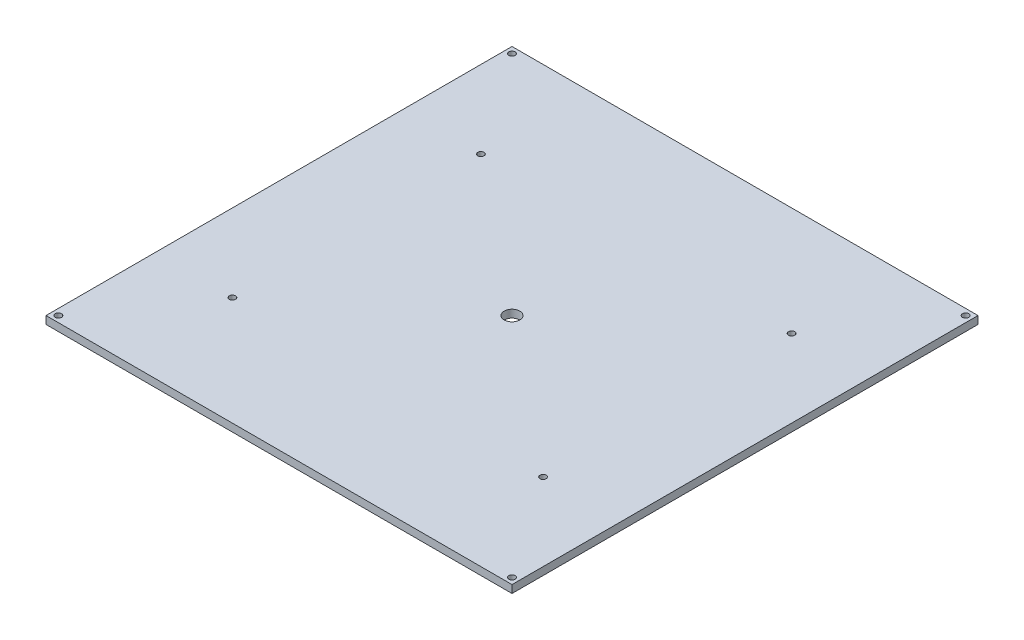
ISO-10303-21;
HEADER;
FILE_DESCRIPTION(('STEP AP214'),'2;1');
FILE_NAME('part.step','',(''),(''),'','','');
FILE_SCHEMA(('AUTOMOTIVE_DESIGN { 1 0 10303 214 1 1 1 1 }'));
ENDSEC;
DATA;
#1=APPLICATION_CONTEXT('core data for automotive mechanical design processes');
#2=APPLICATION_PROTOCOL_DEFINITION('international standard','automotive_design',2000,#1);
#3=PRODUCT_CONTEXT('',#1,'mechanical');
#4=PRODUCT('Part','Part','',(#3));
#5=PRODUCT_RELATED_PRODUCT_CATEGORY('part','',(#4));
#6=PRODUCT_DEFINITION_FORMATION('','',#4);
#7=PRODUCT_DEFINITION_CONTEXT('part definition',#1,'design');
#8=PRODUCT_DEFINITION('design','',#6,#7);
#9=PRODUCT_DEFINITION_SHAPE('','',#8);
#10=(LENGTH_UNIT() NAMED_UNIT(*) SI_UNIT(.MILLI.,.METRE.));
#11=(NAMED_UNIT(*) PLANE_ANGLE_UNIT() SI_UNIT($,.RADIAN.));
#12=(NAMED_UNIT(*) SI_UNIT($,.STERADIAN.) SOLID_ANGLE_UNIT());
#13=UNCERTAINTY_MEASURE_WITH_UNIT(LENGTH_MEASURE(1.E-05),#10,'distance_accuracy_value','');
#14=(GEOMETRIC_REPRESENTATION_CONTEXT(3) GLOBAL_UNCERTAINTY_ASSIGNED_CONTEXT((#13)) GLOBAL_UNIT_ASSIGNED_CONTEXT((#10,
#11,#12)) REPRESENTATION_CONTEXT('',''));
#15=CARTESIAN_POINT('',(0.,0.,0.));
#16=DIRECTION('',(0.,0.,1.));
#17=DIRECTION('',(1.,0.,0.));
#18=AXIS2_PLACEMENT_3D('',#15,#16,#17);
#19=CARTESIAN_POINT('',(-150.,5.,150.));
#20=DIRECTION('',(1.,0.,0.));
#21=DIRECTION('',(0.,0.,-1.));
#22=AXIS2_PLACEMENT_3D('',#19,#20,#21);
#23=PLANE('',#22);
#24=DIRECTION('',(0.,0.,1.));
#25=VECTOR('',#24,1.);
#26=CARTESIAN_POINT('',(-150.,0.,150.));
#27=LINE('',#26,#25);
#28=CARTESIAN_POINT('',(-150.,0.,-150.));
#29=VERTEX_POINT('',#28);
#30=CARTESIAN_POINT('',(-150.,0.,150.));
#31=VERTEX_POINT('',#30);
#32=EDGE_CURVE('E111',#29,#31,#27,.T.);
#33=ORIENTED_EDGE('',*,*,#32,.T.);
#34=DIRECTION('',(0.,-1.,0.));
#35=VECTOR('',#34,1.);
#36=CARTESIAN_POINT('',(-150.,5.,150.));
#37=LINE('',#36,#35);
#38=CARTESIAN_POINT('',(-150.,5.,150.));
#39=VERTEX_POINT('',#38);
#40=EDGE_CURVE('E11',#39,#31,#37,.T.);
#41=ORIENTED_EDGE('',*,*,#40,.F.);
#42=DIRECTION('',(0.,0.,1.));
#43=VECTOR('',#42,1.);
#44=CARTESIAN_POINT('',(-150.,5.,150.));
#45=LINE('',#44,#43);
#46=CARTESIAN_POINT('',(-150.,5.,-150.));
#47=VERTEX_POINT('',#46);
#48=EDGE_CURVE('E95',#47,#39,#45,.T.);
#49=ORIENTED_EDGE('',*,*,#48,.F.);
#50=DIRECTION('',(0.,-1.,0.));
#51=VECTOR('',#50,1.);
#52=CARTESIAN_POINT('',(-150.,5.,-150.));
#53=LINE('',#52,#51);
#54=EDGE_CURVE('E107',#47,#29,#53,.T.);
#55=ORIENTED_EDGE('',*,*,#54,.T.);
#56=EDGE_LOOP('',(#33,#41,#49,#55));
#57=FACE_BOUND('',#56,.T.);
#58=ADVANCED_FACE('F43',(#57),#23,.F.);
#59=CARTESIAN_POINT('',(150.,5.,150.));
#60=DIRECTION('',(0.,0.,-1.));
#61=DIRECTION('',(-1.,0.,0.));
#62=AXIS2_PLACEMENT_3D('',#59,#60,#61);
#63=PLANE('',#62);
#64=DIRECTION('',(1.,0.,0.));
#65=VECTOR('',#64,1.);
#66=CARTESIAN_POINT('',(150.,0.,150.));
#67=LINE('',#66,#65);
#68=CARTESIAN_POINT('',(150.,0.,150.));
#69=VERTEX_POINT('',#68);
#70=EDGE_CURVE('E100',#31,#69,#67,.T.);
#71=ORIENTED_EDGE('',*,*,#70,.T.);
#72=DIRECTION('',(0.,-1.,0.));
#73=VECTOR('',#72,1.);
#74=CARTESIAN_POINT('',(150.,5.,150.));
#75=LINE('',#74,#73);
#76=CARTESIAN_POINT('',(150.,5.,150.));
#77=VERTEX_POINT('',#76);
#78=EDGE_CURVE('E52',#77,#69,#75,.T.);
#79=ORIENTED_EDGE('',*,*,#78,.F.);
#80=DIRECTION('',(1.,0.,0.));
#81=VECTOR('',#80,1.);
#82=CARTESIAN_POINT('',(150.,5.,150.));
#83=LINE('',#82,#81);
#84=EDGE_CURVE('E90',#39,#77,#83,.T.);
#85=ORIENTED_EDGE('',*,*,#84,.F.);
#86=ORIENTED_EDGE('',*,*,#40,.T.);
#87=EDGE_LOOP('',(#71,#79,#85,#86));
#88=FACE_BOUND('',#87,.T.);
#89=ADVANCED_FACE('F99',(#88),#63,.F.);
#90=CARTESIAN_POINT('',(150.,5.,150.));
#91=DIRECTION('',(-1.,0.,0.));
#92=DIRECTION('',(0.,0.,1.));
#93=AXIS2_PLACEMENT_3D('',#90,#91,#92);
#94=PLANE('',#93);
#95=DIRECTION('',(0.,0.,-1.));
#96=VECTOR('',#95,1.);
#97=CARTESIAN_POINT('',(150.,0.,150.));
#98=LINE('',#97,#96);
#99=CARTESIAN_POINT('',(150.,0.,-150.));
#100=VERTEX_POINT('',#99);
#101=EDGE_CURVE('E77',#69,#100,#98,.T.);
#102=ORIENTED_EDGE('',*,*,#101,.T.);
#103=DIRECTION('',(0.,-1.,0.));
#104=VECTOR('',#103,1.);
#105=CARTESIAN_POINT('',(150.,5.,-150.));
#106=LINE('',#105,#104);
#107=CARTESIAN_POINT('',(150.,5.,-150.));
#108=VERTEX_POINT('',#107);
#109=EDGE_CURVE('E102',#108,#100,#106,.T.);
#110=ORIENTED_EDGE('',*,*,#109,.F.);
#111=DIRECTION('',(0.,0.,-1.));
#112=VECTOR('',#111,1.);
#113=CARTESIAN_POINT('',(150.,5.,150.));
#114=LINE('',#113,#112);
#115=EDGE_CURVE('E93',#77,#108,#114,.T.);
#116=ORIENTED_EDGE('',*,*,#115,.F.);
#117=ORIENTED_EDGE('',*,*,#78,.T.);
#118=EDGE_LOOP('',(#102,#110,#116,#117));
#119=FACE_BOUND('',#118,.T.);
#120=ADVANCED_FACE('F103',(#119),#94,.F.);
#121=CARTESIAN_POINT('',(150.,5.,-150.));
#122=DIRECTION('',(0.,0.,1.));
#123=DIRECTION('',(1.,0.,0.));
#124=AXIS2_PLACEMENT_3D('',#121,#122,#123);
#125=PLANE('',#124);
#126=DIRECTION('',(-1.,0.,0.));
#127=VECTOR('',#126,1.);
#128=CARTESIAN_POINT('',(150.,0.,-150.));
#129=LINE('',#128,#127);
#130=EDGE_CURVE('E83',#100,#29,#129,.T.);
#131=ORIENTED_EDGE('',*,*,#130,.T.);
#132=ORIENTED_EDGE('',*,*,#54,.F.);
#133=DIRECTION('',(-1.,0.,0.));
#134=VECTOR('',#133,1.);
#135=CARTESIAN_POINT('',(150.,5.,-150.));
#136=LINE('',#135,#134);
#137=EDGE_CURVE('E60',#108,#47,#136,.T.);
#138=ORIENTED_EDGE('',*,*,#137,.F.);
#139=ORIENTED_EDGE('',*,*,#109,.T.);
#140=EDGE_LOOP('',(#131,#132,#138,#139));
#141=FACE_BOUND('',#140,.T.);
#142=ADVANCED_FACE('F125',(#141),#125,.F.);
#143=CARTESIAN_POINT('',(0.,5.,0.));
#144=DIRECTION('',(0.,1.,0.));
#145=DIRECTION('',(0.,0.,1.));
#146=AXIS2_PLACEMENT_3D('',#143,#144,#145);
#147=PLANE('',#146);
#148=CARTESIAN_POINT('',(0.,5.,0.));
#149=DIRECTION('',(0.,1.,0.));
#150=DIRECTION('',(0.,0.,1.));
#151=AXIS2_PLACEMENT_3D('',#148,#149,#150);
#152=CIRCLE('',#151,5.);
#153=CARTESIAN_POINT('',(0.,5.,5.));
#154=VERTEX_POINT('',#153);
#155=EDGE_CURVE('E172',#154,#154,#152,.T.);
#156=ORIENTED_EDGE('',*,*,#155,.F.);
#157=EDGE_LOOP('',(#156));
#158=FACE_BOUND('',#157,.T.);
#159=CARTESIAN_POINT('',(-100.,5.,80.));
#160=DIRECTION('',(0.,1.,0.));
#161=DIRECTION('',(0.,0.,1.));
#162=AXIS2_PLACEMENT_3D('',#159,#160,#161);
#163=CIRCLE('',#162,2.);
#164=CARTESIAN_POINT('',(-100.,5.,82.));
#165=VERTEX_POINT('',#164);
#166=EDGE_CURVE('E181',#165,#165,#163,.T.);
#167=ORIENTED_EDGE('',*,*,#166,.F.);
#168=EDGE_LOOP('',(#167));
#169=FACE_BOUND('',#168,.T.);
#170=CARTESIAN_POINT('',(100.,5.,80.));
#171=DIRECTION('',(0.,1.,0.));
#172=DIRECTION('',(0.,0.,1.));
#173=AXIS2_PLACEMENT_3D('',#170,#171,#172);
#174=CIRCLE('',#173,2.);
#175=CARTESIAN_POINT('',(100.,5.,82.));
#176=VERTEX_POINT('',#175);
#177=EDGE_CURVE('E189',#176,#176,#174,.T.);
#178=ORIENTED_EDGE('',*,*,#177,.F.);
#179=EDGE_LOOP('',(#178));
#180=FACE_BOUND('',#179,.T.);
#181=CARTESIAN_POINT('',(100.,5.,-80.));
#182=DIRECTION('',(0.,1.,0.));
#183=DIRECTION('',(0.,0.,1.));
#184=AXIS2_PLACEMENT_3D('',#181,#182,#183);
#185=CIRCLE('',#184,2.);
#186=CARTESIAN_POINT('',(100.,5.,-78.));
#187=VERTEX_POINT('',#186);
#188=EDGE_CURVE('E171',#187,#187,#185,.T.);
#189=ORIENTED_EDGE('',*,*,#188,.F.);
#190=EDGE_LOOP('',(#189));
#191=FACE_BOUND('',#190,.T.);
#192=CARTESIAN_POINT('',(-100.,5.,-80.));
#193=DIRECTION('',(0.,1.,0.));
#194=DIRECTION('',(0.,0.,1.));
#195=AXIS2_PLACEMENT_3D('',#192,#193,#194);
#196=CIRCLE('',#195,2.);
#197=CARTESIAN_POINT('',(-100.,5.,-78.));
#198=VERTEX_POINT('',#197);
#199=EDGE_CURVE('E167',#198,#198,#196,.T.);
#200=ORIENTED_EDGE('',*,*,#199,.F.);
#201=EDGE_LOOP('',(#200));
#202=FACE_BOUND('',#201,.T.);
#203=CARTESIAN_POINT('',(146.,5.,146.));
#204=DIRECTION('',(0.,1.,0.));
#205=DIRECTION('',(0.,0.,-1.));
#206=AXIS2_PLACEMENT_3D('',#203,#204,#205);
#207=CIRCLE('',#206,2.04999999999999);
#208=CARTESIAN_POINT('',(146.,5.,143.95));
#209=VERTEX_POINT('',#208);
#210=EDGE_CURVE('E159',#209,#209,#207,.T.);
#211=ORIENTED_EDGE('',*,*,#210,.F.);
#212=EDGE_LOOP('',(#211));
#213=FACE_BOUND('',#212,.T.);
#214=CARTESIAN_POINT('',(146.,5.,-146.));
#215=DIRECTION('',(0.,-1.,0.));
#216=DIRECTION('',(0.,0.,1.));
#217=AXIS2_PLACEMENT_3D('',#214,#215,#216);
#218=CIRCLE('',#217,2.04999999999999);
#219=CARTESIAN_POINT('',(146.,5.,-143.95));
#220=VERTEX_POINT('',#219);
#221=EDGE_CURVE('E144',#220,#220,#218,.T.);
#222=ORIENTED_EDGE('',*,*,#221,.T.);
#223=EDGE_LOOP('',(#222));
#224=FACE_BOUND('',#223,.T.);
#225=CARTESIAN_POINT('',(-146.,5.,146.));
#226=DIRECTION('',(0.,-1.,0.));
#227=DIRECTION('',(0.,0.,-1.));
#228=AXIS2_PLACEMENT_3D('',#225,#226,#227);
#229=CIRCLE('',#228,2.04999999999999);
#230=CARTESIAN_POINT('',(-146.,5.,143.95));
#231=VERTEX_POINT('',#230);
#232=EDGE_CURVE('E139',#231,#231,#229,.T.);
#233=ORIENTED_EDGE('',*,*,#232,.T.);
#234=EDGE_LOOP('',(#233));
#235=FACE_BOUND('',#234,.T.);
#236=CARTESIAN_POINT('',(-146.,5.,-146.));
#237=DIRECTION('',(0.,1.,0.));
#238=DIRECTION('',(0.,0.,1.));
#239=AXIS2_PLACEMENT_3D('',#236,#237,#238);
#240=CIRCLE('',#239,2.04999999999999);
#241=CARTESIAN_POINT('',(-146.,5.,-143.95));
#242=VERTEX_POINT('',#241);
#243=EDGE_CURVE('E135',#242,#242,#240,.T.);
#244=ORIENTED_EDGE('',*,*,#243,.F.);
#245=EDGE_LOOP('',(#244));
#246=FACE_BOUND('',#245,.T.);
#247=ORIENTED_EDGE('',*,*,#48,.T.);
#248=ORIENTED_EDGE('',*,*,#84,.T.);
#249=ORIENTED_EDGE('',*,*,#115,.T.);
#250=ORIENTED_EDGE('',*,*,#137,.T.);
#251=EDGE_LOOP('',(#247,#248,#249,#250));
#252=FACE_BOUND('',#251,.T.);
#253=ADVANCED_FACE('F91',(#158,#169,#180,#191,#202,#213,#224,#235,#246,#252),#147,.T.);
#254=CARTESIAN_POINT('',(0.,0.,0.));
#255=DIRECTION('',(0.,1.,0.));
#256=DIRECTION('',(0.,0.,1.));
#257=AXIS2_PLACEMENT_3D('',#254,#255,#256);
#258=PLANE('',#257);
#259=CARTESIAN_POINT('',(0.,0.,0.));
#260=DIRECTION('',(0.,1.,0.));
#261=DIRECTION('',(0.,0.,1.));
#262=AXIS2_PLACEMENT_3D('',#259,#260,#261);
#263=CIRCLE('',#262,5.);
#264=CARTESIAN_POINT('',(0.,0.,5.));
#265=VERTEX_POINT('',#264);
#266=EDGE_CURVE('E177',#265,#265,#263,.F.);
#267=ORIENTED_EDGE('',*,*,#266,.F.);
#268=EDGE_LOOP('',(#267));
#269=FACE_BOUND('',#268,.T.);
#270=CARTESIAN_POINT('',(-100.,0.,80.));
#271=DIRECTION('',(0.,1.,0.));
#272=DIRECTION('',(0.,0.,1.));
#273=AXIS2_PLACEMENT_3D('',#270,#271,#272);
#274=CIRCLE('',#273,2.);
#275=CARTESIAN_POINT('',(-100.,0.,82.));
#276=VERTEX_POINT('',#275);
#277=EDGE_CURVE('E176',#276,#276,#274,.F.);
#278=ORIENTED_EDGE('',*,*,#277,.F.);
#279=EDGE_LOOP('',(#278));
#280=FACE_BOUND('',#279,.T.);
#281=CARTESIAN_POINT('',(100.,0.,80.));
#282=DIRECTION('',(0.,1.,0.));
#283=DIRECTION('',(0.,0.,1.));
#284=AXIS2_PLACEMENT_3D('',#281,#282,#283);
#285=CIRCLE('',#284,2.);
#286=CARTESIAN_POINT('',(100.,0.,82.));
#287=VERTEX_POINT('',#286);
#288=EDGE_CURVE('E185',#287,#287,#285,.F.);
#289=ORIENTED_EDGE('',*,*,#288,.F.);
#290=EDGE_LOOP('',(#289));
#291=FACE_BOUND('',#290,.T.);
#292=CARTESIAN_POINT('',(100.,0.,-80.));
#293=DIRECTION('',(0.,1.,0.));
#294=DIRECTION('',(0.,0.,1.));
#295=AXIS2_PLACEMENT_3D('',#292,#293,#294);
#296=CIRCLE('',#295,2.);
#297=CARTESIAN_POINT('',(100.,0.,-78.));
#298=VERTEX_POINT('',#297);
#299=EDGE_CURVE('E193',#298,#298,#296,.F.);
#300=ORIENTED_EDGE('',*,*,#299,.F.);
#301=EDGE_LOOP('',(#300));
#302=FACE_BOUND('',#301,.T.);
#303=CARTESIAN_POINT('',(-100.,0.,-80.));
#304=DIRECTION('',(0.,1.,0.));
#305=DIRECTION('',(0.,0.,1.));
#306=AXIS2_PLACEMENT_3D('',#303,#304,#305);
#307=CIRCLE('',#306,2.);
#308=CARTESIAN_POINT('',(-100.,0.,-78.));
#309=VERTEX_POINT('',#308);
#310=EDGE_CURVE('E163',#309,#309,#307,.F.);
#311=ORIENTED_EDGE('',*,*,#310,.F.);
#312=EDGE_LOOP('',(#311));
#313=FACE_BOUND('',#312,.T.);
#314=CARTESIAN_POINT('',(146.,0.,146.));
#315=DIRECTION('',(0.,1.,0.));
#316=DIRECTION('',(0.,0.,1.));
#317=AXIS2_PLACEMENT_3D('',#314,#315,#316);
#318=CIRCLE('',#317,2.04999999999999);
#319=CARTESIAN_POINT('',(146.,0.,148.05));
#320=VERTEX_POINT('',#319);
#321=EDGE_CURVE('E152',#320,#320,#318,.F.);
#322=ORIENTED_EDGE('',*,*,#321,.F.);
#323=EDGE_LOOP('',(#322));
#324=FACE_BOUND('',#323,.T.);
#325=CARTESIAN_POINT('',(146.,0.,-146.));
#326=DIRECTION('',(0.,1.,0.));
#327=DIRECTION('',(0.,0.,1.));
#328=AXIS2_PLACEMENT_3D('',#325,#326,#327);
#329=CIRCLE('',#328,2.04999999999999);
#330=CARTESIAN_POINT('',(146.,0.,-143.95));
#331=VERTEX_POINT('',#330);
#332=EDGE_CURVE('E148',#331,#331,#329,.T.);
#333=ORIENTED_EDGE('',*,*,#332,.T.);
#334=EDGE_LOOP('',(#333));
#335=FACE_BOUND('',#334,.T.);
#336=CARTESIAN_POINT('',(-146.,0.,146.));
#337=DIRECTION('',(0.,1.,0.));
#338=DIRECTION('',(0.,0.,1.));
#339=AXIS2_PLACEMENT_3D('',#336,#337,#338);
#340=CIRCLE('',#339,2.04999999999999);
#341=CARTESIAN_POINT('',(-146.,0.,148.05));
#342=VERTEX_POINT('',#341);
#343=EDGE_CURVE('E140',#342,#342,#340,.T.);
#344=ORIENTED_EDGE('',*,*,#343,.T.);
#345=EDGE_LOOP('',(#344));
#346=FACE_BOUND('',#345,.T.);
#347=CARTESIAN_POINT('',(-146.,0.,-146.));
#348=DIRECTION('',(0.,1.,0.));
#349=DIRECTION('',(0.,0.,1.));
#350=AXIS2_PLACEMENT_3D('',#347,#348,#349);
#351=CIRCLE('',#350,2.04999999999999);
#352=CARTESIAN_POINT('',(-146.,0.,-143.95));
#353=VERTEX_POINT('',#352);
#354=EDGE_CURVE('E115',#353,#353,#351,.F.);
#355=ORIENTED_EDGE('',*,*,#354,.F.);
#356=EDGE_LOOP('',(#355));
#357=FACE_BOUND('',#356,.T.);
#358=ORIENTED_EDGE('',*,*,#32,.F.);
#359=ORIENTED_EDGE('',*,*,#130,.F.);
#360=ORIENTED_EDGE('',*,*,#101,.F.);
#361=ORIENTED_EDGE('',*,*,#70,.F.);
#362=EDGE_LOOP('',(#358,#359,#360,#361));
#363=FACE_BOUND('',#362,.T.);
#364=ADVANCED_FACE('F128',(#269,#280,#291,#302,#313,#324,#335,#346,#357,#363),#258,.F.);
#365=CARTESIAN_POINT('',(-146.,-0.00100000000000013,-146.));
#366=DIRECTION('',(0.,1.,0.));
#367=DIRECTION('',(0.,0.,1.));
#368=AXIS2_PLACEMENT_3D('',#365,#366,#367);
#369=CYLINDRICAL_SURFACE('',#368,2.04999999999999);
#370=ORIENTED_EDGE('',*,*,#243,.T.);
#371=EDGE_LOOP('',(#370));
#372=FACE_BOUND('',#371,.T.);
#373=ORIENTED_EDGE('',*,*,#354,.T.);
#374=EDGE_LOOP('',(#373));
#375=FACE_BOUND('',#374,.T.);
#376=ADVANCED_FACE('F208',(#372,#375),#369,.F.);
#377=CARTESIAN_POINT('',(-146.,-0.00100000000000013,146.));
#378=DIRECTION('',(0.,1.,0.));
#379=DIRECTION('',(0.,0.,1.));
#380=AXIS2_PLACEMENT_3D('',#377,#378,#379);
#381=CYLINDRICAL_SURFACE('',#380,2.04999999999999);
#382=ORIENTED_EDGE('',*,*,#232,.F.);
#383=EDGE_LOOP('',(#382));
#384=FACE_BOUND('',#383,.T.);
#385=ORIENTED_EDGE('',*,*,#343,.F.);
#386=EDGE_LOOP('',(#385));
#387=FACE_BOUND('',#386,.T.);
#388=ADVANCED_FACE('F222',(#384,#387),#381,.F.);
#389=CARTESIAN_POINT('',(146.,-0.00100000000000013,-146.));
#390=DIRECTION('',(0.,1.,0.));
#391=DIRECTION('',(0.,0.,1.));
#392=AXIS2_PLACEMENT_3D('',#389,#390,#391);
#393=CYLINDRICAL_SURFACE('',#392,2.04999999999999);
#394=ORIENTED_EDGE('',*,*,#221,.F.);
#395=EDGE_LOOP('',(#394));
#396=FACE_BOUND('',#395,.T.);
#397=ORIENTED_EDGE('',*,*,#332,.F.);
#398=EDGE_LOOP('',(#397));
#399=FACE_BOUND('',#398,.T.);
#400=ADVANCED_FACE('F228',(#396,#399),#393,.F.);
#401=CARTESIAN_POINT('',(146.,-0.00100000000000013,146.));
#402=DIRECTION('',(0.,1.,0.));
#403=DIRECTION('',(0.,0.,1.));
#404=AXIS2_PLACEMENT_3D('',#401,#402,#403);
#405=CYLINDRICAL_SURFACE('',#404,2.04999999999999);
#406=ORIENTED_EDGE('',*,*,#210,.T.);
#407=EDGE_LOOP('',(#406));
#408=FACE_BOUND('',#407,.T.);
#409=ORIENTED_EDGE('',*,*,#321,.T.);
#410=EDGE_LOOP('',(#409));
#411=FACE_BOUND('',#410,.T.);
#412=ADVANCED_FACE('F267',(#408,#411),#405,.F.);
#413=CARTESIAN_POINT('',(-100.,-0.00100000000000013,-80.));
#414=DIRECTION('',(0.,1.,0.));
#415=DIRECTION('',(0.,0.,1.));
#416=AXIS2_PLACEMENT_3D('',#413,#414,#415);
#417=CYLINDRICAL_SURFACE('',#416,2.);
#418=ORIENTED_EDGE('',*,*,#199,.T.);
#419=EDGE_LOOP('',(#418));
#420=FACE_BOUND('',#419,.T.);
#421=ORIENTED_EDGE('',*,*,#310,.T.);
#422=EDGE_LOOP('',(#421));
#423=FACE_BOUND('',#422,.T.);
#424=ADVANCED_FACE('F272',(#420,#423),#417,.F.);
#425=CARTESIAN_POINT('',(100.,-0.00100000000000013,-80.));
#426=DIRECTION('',(0.,1.,0.));
#427=DIRECTION('',(0.,0.,1.));
#428=AXIS2_PLACEMENT_3D('',#425,#426,#427);
#429=CYLINDRICAL_SURFACE('',#428,2.);
#430=ORIENTED_EDGE('',*,*,#188,.T.);
#431=EDGE_LOOP('',(#430));
#432=FACE_BOUND('',#431,.T.);
#433=ORIENTED_EDGE('',*,*,#299,.T.);
#434=EDGE_LOOP('',(#433));
#435=FACE_BOUND('',#434,.T.);
#436=ADVANCED_FACE('F204',(#432,#435),#429,.F.);
#437=CARTESIAN_POINT('',(100.,-0.00100000000000013,80.));
#438=DIRECTION('',(0.,1.,0.));
#439=DIRECTION('',(0.,0.,1.));
#440=AXIS2_PLACEMENT_3D('',#437,#438,#439);
#441=CYLINDRICAL_SURFACE('',#440,2.);
#442=ORIENTED_EDGE('',*,*,#177,.T.);
#443=EDGE_LOOP('',(#442));
#444=FACE_BOUND('',#443,.T.);
#445=ORIENTED_EDGE('',*,*,#288,.T.);
#446=EDGE_LOOP('',(#445));
#447=FACE_BOUND('',#446,.T.);
#448=ADVANCED_FACE('F286',(#444,#447),#441,.F.);
#449=CARTESIAN_POINT('',(-100.,-0.00100000000000013,80.));
#450=DIRECTION('',(0.,1.,0.));
#451=DIRECTION('',(0.,0.,1.));
#452=AXIS2_PLACEMENT_3D('',#449,#450,#451);
#453=CYLINDRICAL_SURFACE('',#452,2.);
#454=ORIENTED_EDGE('',*,*,#166,.T.);
#455=EDGE_LOOP('',(#454));
#456=FACE_BOUND('',#455,.T.);
#457=ORIENTED_EDGE('',*,*,#277,.T.);
#458=EDGE_LOOP('',(#457));
#459=FACE_BOUND('',#458,.T.);
#460=ADVANCED_FACE('F282',(#456,#459),#453,.F.);
#461=CARTESIAN_POINT('',(0.,-0.00100000000000013,0.));
#462=DIRECTION('',(0.,1.,0.));
#463=DIRECTION('',(0.,0.,1.));
#464=AXIS2_PLACEMENT_3D('',#461,#462,#463);
#465=CYLINDRICAL_SURFACE('',#464,5.);
#466=ORIENTED_EDGE('',*,*,#155,.T.);
#467=EDGE_LOOP('',(#466));
#468=FACE_BOUND('',#467,.T.);
#469=ORIENTED_EDGE('',*,*,#266,.T.);
#470=EDGE_LOOP('',(#469));
#471=FACE_BOUND('',#470,.T.);
#472=ADVANCED_FACE('F279',(#468,#471),#465,.F.);
#473=CLOSED_SHELL('',(#58,#89,#120,#142,#253,#364,#376,#388,#400,#412,#424,#436,#448,#460,#472));
#474=MANIFOLD_SOLID_BREP('B2',#473);
#475=ADVANCED_BREP_SHAPE_REPRESENTATION('',(#18,#474),#14);
#476=SHAPE_DEFINITION_REPRESENTATION(#9,#475);
ENDSEC;
END-ISO-10303-21;
